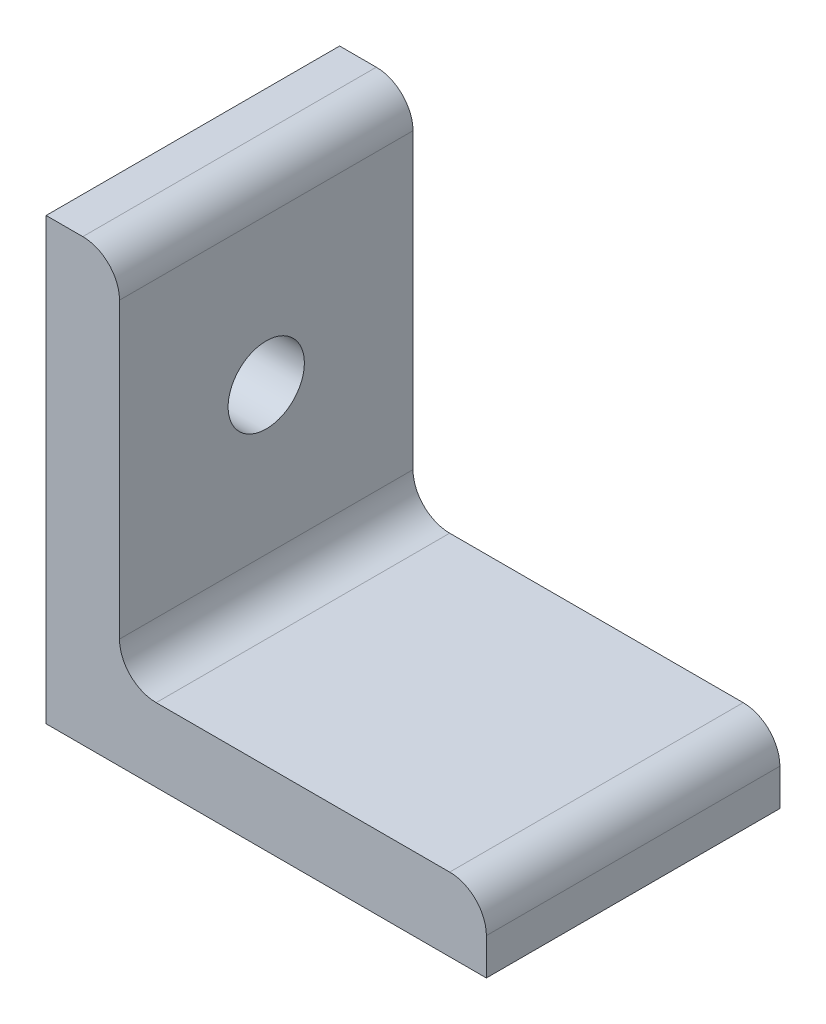
ISO-10303-21;
HEADER;
FILE_DESCRIPTION(('STEP AP214'),'2;1');
FILE_NAME('part.step','',(''),(''),'','','');
FILE_SCHEMA(('AUTOMOTIVE_DESIGN { 1 0 10303 214 1 1 1 1 }'));
ENDSEC;
DATA;
#1=APPLICATION_CONTEXT('core data for automotive mechanical design processes');
#2=APPLICATION_PROTOCOL_DEFINITION('international standard','automotive_design',2000,#1);
#3=PRODUCT_CONTEXT('',#1,'mechanical');
#4=PRODUCT('Part','Part','',(#3));
#5=PRODUCT_RELATED_PRODUCT_CATEGORY('part','',(#4));
#6=PRODUCT_DEFINITION_FORMATION('','',#4);
#7=PRODUCT_DEFINITION_CONTEXT('part definition',#1,'design');
#8=PRODUCT_DEFINITION('design','',#6,#7);
#9=PRODUCT_DEFINITION_SHAPE('','',#8);
#10=(LENGTH_UNIT() NAMED_UNIT(*) SI_UNIT(.MILLI.,.METRE.));
#11=(NAMED_UNIT(*) PLANE_ANGLE_UNIT() SI_UNIT($,.RADIAN.));
#12=(NAMED_UNIT(*) SI_UNIT($,.STERADIAN.) SOLID_ANGLE_UNIT());
#13=UNCERTAINTY_MEASURE_WITH_UNIT(LENGTH_MEASURE(1.E-05),#10,'distance_accuracy_value','');
#14=(GEOMETRIC_REPRESENTATION_CONTEXT(3) GLOBAL_UNCERTAINTY_ASSIGNED_CONTEXT((#13)) GLOBAL_UNIT_ASSIGNED_CONTEXT((#10,
#11,#12)) REPRESENTATION_CONTEXT('',''));
#15=CARTESIAN_POINT('',(0.,0.,0.));
#16=DIRECTION('',(0.,0.,1.));
#17=DIRECTION('',(1.,0.,0.));
#18=AXIS2_PLACEMENT_3D('',#15,#16,#17);
#19=CARTESIAN_POINT('',(3.175,3.175,6.35));
#20=DIRECTION('',(-1.,0.,0.));
#21=DIRECTION('',(0.,-1.,0.));
#22=AXIS2_PLACEMENT_3D('',#19,#20,#21);
#23=PLANE('',#22);
#24=CARTESIAN_POINT('',(3.175,11.1125,0.));
#25=DIRECTION('',(1.,0.,0.));
#26=DIRECTION('',(0.,0.,-1.));
#27=AXIS2_PLACEMENT_3D('',#24,#25,#26);
#28=CIRCLE('',#27,1.65);
#29=CARTESIAN_POINT('',(3.175,11.1125,-1.65));
#30=VERTEX_POINT('',#29);
#31=EDGE_CURVE('E228',#30,#30,#28,.T.);
#32=ORIENTED_EDGE('',*,*,#31,.F.);
#33=EDGE_LOOP('',(#32));
#34=FACE_BOUND('',#33,.T.);
#35=DIRECTION('',(0.,1.,0.));
#36=VECTOR('',#35,1.);
#37=CARTESIAN_POINT('',(3.175,3.175,6.35));
#38=LINE('',#37,#36);
#39=CARTESIAN_POINT('',(3.175,4.7625,6.35));
#40=VERTEX_POINT('',#39);
#41=CARTESIAN_POINT('',(3.175,17.4625,6.35));
#42=VERTEX_POINT('',#41);
#43=EDGE_CURVE('E125',#40,#42,#38,.T.);
#44=ORIENTED_EDGE('',*,*,#43,.F.);
#45=DIRECTION('',(0.,0.,-1.));
#46=VECTOR('',#45,1.);
#47=CARTESIAN_POINT('',(3.175,4.7625,-6.35));
#48=LINE('',#47,#46);
#49=CARTESIAN_POINT('',(3.175,4.7625,-6.35));
#50=VERTEX_POINT('',#49);
#51=EDGE_CURVE('E203',#40,#50,#48,.T.);
#52=ORIENTED_EDGE('',*,*,#51,.T.);
#53=DIRECTION('',(0.,1.,0.));
#54=VECTOR('',#53,1.);
#55=CARTESIAN_POINT('',(3.175,3.175,-6.35));
#56=LINE('',#55,#54);
#57=CARTESIAN_POINT('',(3.175,17.4625,-6.35));
#58=VERTEX_POINT('',#57);
#59=EDGE_CURVE('E156',#50,#58,#56,.T.);
#60=ORIENTED_EDGE('',*,*,#59,.T.);
#61=DIRECTION('',(0.,0.,-1.));
#62=VECTOR('',#61,1.);
#63=CARTESIAN_POINT('',(3.175,17.4625,6.35));
#64=LINE('',#63,#62);
#65=EDGE_CURVE('E68',#58,#42,#64,.F.);
#66=ORIENTED_EDGE('',*,*,#65,.T.);
#67=EDGE_LOOP('',(#44,#52,#60,#66));
#68=FACE_BOUND('',#67,.T.);
#69=ADVANCED_FACE('F44',(#34,#68),#23,.F.);
#70=CARTESIAN_POINT('',(3.175,19.05,6.35));
#71=DIRECTION('',(0.,-1.,0.));
#72=DIRECTION('',(0.,0.,-1.));
#73=AXIS2_PLACEMENT_3D('',#70,#71,#72);
#74=PLANE('',#73);
#75=DIRECTION('',(-1.,0.,0.));
#76=VECTOR('',#75,1.);
#77=CARTESIAN_POINT('',(3.175,19.05,6.35));
#78=LINE('',#77,#76);
#79=CARTESIAN_POINT('',(1.5875,19.05,6.35));
#80=VERTEX_POINT('',#79);
#81=CARTESIAN_POINT('',(0.,19.05,6.35));
#82=VERTEX_POINT('',#81);
#83=EDGE_CURVE('E114',#80,#82,#78,.T.);
#84=ORIENTED_EDGE('',*,*,#83,.F.);
#85=DIRECTION('',(0.,0.,-1.));
#86=VECTOR('',#85,1.);
#87=CARTESIAN_POINT('',(1.5875,19.05,6.35));
#88=LINE('',#87,#86);
#89=CARTESIAN_POINT('',(1.5875,19.05,-6.35));
#90=VERTEX_POINT('',#89);
#91=EDGE_CURVE('E207',#80,#90,#88,.T.);
#92=ORIENTED_EDGE('',*,*,#91,.T.);
#93=DIRECTION('',(-1.,0.,0.));
#94=VECTOR('',#93,1.);
#95=CARTESIAN_POINT('',(3.175,19.05,-6.35));
#96=LINE('',#95,#94);
#97=CARTESIAN_POINT('',(0.,19.05,-6.35));
#98=VERTEX_POINT('',#97);
#99=EDGE_CURVE('E131',#90,#98,#96,.T.);
#100=ORIENTED_EDGE('',*,*,#99,.T.);
#101=DIRECTION('',(0.,0.,-1.));
#102=VECTOR('',#101,1.);
#103=CARTESIAN_POINT('',(0.,19.05,6.35));
#104=LINE('',#103,#102);
#105=EDGE_CURVE('E128',#82,#98,#104,.T.);
#106=ORIENTED_EDGE('',*,*,#105,.F.);
#107=EDGE_LOOP('',(#84,#92,#100,#106));
#108=FACE_BOUND('',#107,.T.);
#109=ADVANCED_FACE('F129',(#108),#74,.F.);
#110=CARTESIAN_POINT('',(0.,19.05,6.35));
#111=DIRECTION('',(1.,0.,0.));
#112=DIRECTION('',(0.,1.,0.));
#113=AXIS2_PLACEMENT_3D('',#110,#111,#112);
#114=PLANE('',#113);
#115=CARTESIAN_POINT('',(0.,11.1125,0.));
#116=DIRECTION('',(1.,0.,0.));
#117=DIRECTION('',(0.,0.,-1.));
#118=AXIS2_PLACEMENT_3D('',#115,#116,#117);
#119=CIRCLE('',#118,1.65);
#120=CARTESIAN_POINT('',(0.,11.1125,-1.65));
#121=VERTEX_POINT('',#120);
#122=EDGE_CURVE('E159',#121,#121,#119,.T.);
#123=ORIENTED_EDGE('',*,*,#122,.T.);
#124=EDGE_LOOP('',(#123));
#125=FACE_BOUND('',#124,.T.);
#126=DIRECTION('',(0.,-1.,0.));
#127=VECTOR('',#126,1.);
#128=CARTESIAN_POINT('',(0.,19.05,-6.35));
#129=LINE('',#128,#127);
#130=CARTESIAN_POINT('',(0.,0.,-6.35));
#131=VERTEX_POINT('',#130);
#132=EDGE_CURVE('E162',#98,#131,#129,.T.);
#133=ORIENTED_EDGE('',*,*,#132,.T.);
#134=DIRECTION('',(0.,0.,-1.));
#135=VECTOR('',#134,1.);
#136=CARTESIAN_POINT('',(0.,0.,6.35));
#137=LINE('',#136,#135);
#138=CARTESIAN_POINT('',(0.,0.,6.35));
#139=VERTEX_POINT('',#138);
#140=EDGE_CURVE('E136',#139,#131,#137,.T.);
#141=ORIENTED_EDGE('',*,*,#140,.F.);
#142=DIRECTION('',(0.,-1.,0.));
#143=VECTOR('',#142,1.);
#144=CARTESIAN_POINT('',(0.,19.05,6.35));
#145=LINE('',#144,#143);
#146=EDGE_CURVE('E119',#82,#139,#145,.T.);
#147=ORIENTED_EDGE('',*,*,#146,.F.);
#148=ORIENTED_EDGE('',*,*,#105,.T.);
#149=EDGE_LOOP('',(#133,#141,#147,#148));
#150=FACE_BOUND('',#149,.T.);
#151=ADVANCED_FACE('F138',(#125,#150),#114,.F.);
#152=CARTESIAN_POINT('',(0.,0.,6.35));
#153=DIRECTION('',(0.,1.,0.));
#154=DIRECTION('',(0.,0.,1.));
#155=AXIS2_PLACEMENT_3D('',#152,#153,#154);
#156=PLANE('',#155);
#157=DIRECTION('',(1.,0.,0.));
#158=VECTOR('',#157,1.);
#159=CARTESIAN_POINT('',(0.,0.,-6.35));
#160=LINE('',#159,#158);
#161=CARTESIAN_POINT('',(19.05,0.,-6.35));
#162=VERTEX_POINT('',#161);
#163=EDGE_CURVE('E165',#131,#162,#160,.T.);
#164=ORIENTED_EDGE('',*,*,#163,.T.);
#165=DIRECTION('',(0.,0.,-1.));
#166=VECTOR('',#165,1.);
#167=CARTESIAN_POINT('',(19.05,0.,6.35));
#168=LINE('',#167,#166);
#169=CARTESIAN_POINT('',(19.05,0.,6.35));
#170=VERTEX_POINT('',#169);
#171=EDGE_CURVE('E155',#170,#162,#168,.T.);
#172=ORIENTED_EDGE('',*,*,#171,.F.);
#173=DIRECTION('',(1.,0.,0.));
#174=VECTOR('',#173,1.);
#175=CARTESIAN_POINT('',(0.,0.,6.35));
#176=LINE('',#175,#174);
#177=EDGE_CURVE('E142',#139,#170,#176,.T.);
#178=ORIENTED_EDGE('',*,*,#177,.F.);
#179=ORIENTED_EDGE('',*,*,#140,.T.);
#180=EDGE_LOOP('',(#164,#172,#178,#179));
#181=FACE_BOUND('',#180,.T.);
#182=ADVANCED_FACE('F259',(#181),#156,.F.);
#183=CARTESIAN_POINT('',(19.05,0.,6.35));
#184=DIRECTION('',(-1.,0.,0.));
#185=DIRECTION('',(0.,0.,1.));
#186=AXIS2_PLACEMENT_3D('',#183,#184,#185);
#187=PLANE('',#186);
#188=DIRECTION('',(0.,1.,0.));
#189=VECTOR('',#188,1.);
#190=CARTESIAN_POINT('',(19.05,0.,-6.35));
#191=LINE('',#190,#189);
#192=CARTESIAN_POINT('',(19.05,1.5875,-6.35));
#193=VERTEX_POINT('',#192);
#194=EDGE_CURVE('E168',#162,#193,#191,.T.);
#195=ORIENTED_EDGE('',*,*,#194,.T.);
#196=DIRECTION('',(0.,0.,-1.));
#197=VECTOR('',#196,1.);
#198=CARTESIAN_POINT('',(19.05,1.5875,6.35));
#199=LINE('',#198,#197);
#200=CARTESIAN_POINT('',(19.05,1.5875,6.35));
#201=VERTEX_POINT('',#200);
#202=EDGE_CURVE('E193',#193,#201,#199,.F.);
#203=ORIENTED_EDGE('',*,*,#202,.T.);
#204=DIRECTION('',(0.,1.,0.));
#205=VECTOR('',#204,1.);
#206=CARTESIAN_POINT('',(19.05,0.,6.35));
#207=LINE('',#206,#205);
#208=EDGE_CURVE('E145',#170,#201,#207,.T.);
#209=ORIENTED_EDGE('',*,*,#208,.F.);
#210=ORIENTED_EDGE('',*,*,#171,.T.);
#211=EDGE_LOOP('',(#195,#203,#209,#210));
#212=FACE_BOUND('',#211,.T.);
#213=ADVANCED_FACE('F265',(#212),#187,.F.);
#214=CARTESIAN_POINT('',(19.05,3.175,6.35));
#215=DIRECTION('',(0.,-1.,0.));
#216=DIRECTION('',(1.,0.,0.));
#217=AXIS2_PLACEMENT_3D('',#214,#215,#216);
#218=PLANE('',#217);
#219=DIRECTION('',(-1.,0.,0.));
#220=VECTOR('',#219,1.);
#221=CARTESIAN_POINT('',(19.05,3.175,6.35));
#222=LINE('',#221,#220);
#223=CARTESIAN_POINT('',(17.4625,3.175,6.35));
#224=VERTEX_POINT('',#223);
#225=CARTESIAN_POINT('',(4.7625,3.175,6.35));
#226=VERTEX_POINT('',#225);
#227=EDGE_CURVE('E151',#224,#226,#222,.T.);
#228=ORIENTED_EDGE('',*,*,#227,.F.);
#229=DIRECTION('',(0.,0.,-1.));
#230=VECTOR('',#229,1.);
#231=CARTESIAN_POINT('',(17.4625,3.175,6.35));
#232=LINE('',#231,#230);
#233=CARTESIAN_POINT('',(17.4625,3.175,-6.35));
#234=VERTEX_POINT('',#233);
#235=EDGE_CURVE('E183',#224,#234,#232,.T.);
#236=ORIENTED_EDGE('',*,*,#235,.T.);
#237=DIRECTION('',(-1.,0.,0.));
#238=VECTOR('',#237,1.);
#239=CARTESIAN_POINT('',(19.05,3.175,-6.35));
#240=LINE('',#239,#238);
#241=CARTESIAN_POINT('',(4.7625,3.175,-6.35));
#242=VERTEX_POINT('',#241);
#243=EDGE_CURVE('E172',#234,#242,#240,.T.);
#244=ORIENTED_EDGE('',*,*,#243,.T.);
#245=DIRECTION('',(0.,0.,-1.));
#246=VECTOR('',#245,1.);
#247=CARTESIAN_POINT('',(4.7625,3.175,6.35));
#248=LINE('',#247,#246);
#249=EDGE_CURVE('E135',#242,#226,#248,.F.);
#250=ORIENTED_EDGE('',*,*,#249,.T.);
#251=EDGE_LOOP('',(#228,#236,#244,#250));
#252=FACE_BOUND('',#251,.T.);
#253=ADVANCED_FACE('F219',(#252),#218,.F.);
#254=CARTESIAN_POINT('',(0.,0.,6.35));
#255=DIRECTION('',(0.,0.,1.));
#256=DIRECTION('',(1.,0.,0.));
#257=AXIS2_PLACEMENT_3D('',#254,#255,#256);
#258=PLANE('',#257);
#259=ORIENTED_EDGE('',*,*,#208,.T.);
#260=CARTESIAN_POINT('',(17.4625,1.5875,6.35));
#261=DIRECTION('',(0.,0.,1.));
#262=DIRECTION('',(1.,0.,0.));
#263=AXIS2_PLACEMENT_3D('',#260,#261,#262);
#264=CIRCLE('',#263,1.5875);
#265=EDGE_CURVE('E198',#201,#224,#264,.T.);
#266=ORIENTED_EDGE('',*,*,#265,.T.);
#267=ORIENTED_EDGE('',*,*,#227,.T.);
#268=CARTESIAN_POINT('',(4.7625,4.7625,6.35));
#269=DIRECTION('',(0.,0.,1.));
#270=DIRECTION('',(1.,0.,0.));
#271=AXIS2_PLACEMENT_3D('',#268,#269,#270);
#272=CIRCLE('',#271,1.5875);
#273=EDGE_CURVE('E11',#226,#40,#272,.F.);
#274=ORIENTED_EDGE('',*,*,#273,.T.);
#275=ORIENTED_EDGE('',*,*,#43,.T.);
#276=CARTESIAN_POINT('',(1.5875,17.4625,6.35));
#277=DIRECTION('',(0.,0.,1.));
#278=DIRECTION('',(1.,0.,0.));
#279=AXIS2_PLACEMENT_3D('',#276,#277,#278);
#280=CIRCLE('',#279,1.5875);
#281=EDGE_CURVE('E60',#42,#80,#280,.T.);
#282=ORIENTED_EDGE('',*,*,#281,.T.);
#283=ORIENTED_EDGE('',*,*,#83,.T.);
#284=ORIENTED_EDGE('',*,*,#146,.T.);
#285=ORIENTED_EDGE('',*,*,#177,.T.);
#286=EDGE_LOOP('',(#259,#266,#267,#274,#275,#282,#283,#284,#285));
#287=FACE_BOUND('',#286,.T.);
#288=ADVANCED_FACE('F117',(#287),#258,.T.);
#289=CARTESIAN_POINT('',(0.,0.,-6.35));
#290=DIRECTION('',(0.,0.,1.));
#291=DIRECTION('',(1.,0.,0.));
#292=AXIS2_PLACEMENT_3D('',#289,#290,#291);
#293=PLANE('',#292);
#294=ORIENTED_EDGE('',*,*,#243,.F.);
#295=CARTESIAN_POINT('',(17.4625,1.5875,-6.35));
#296=DIRECTION('',(0.,0.,1.));
#297=DIRECTION('',(1.,0.,0.));
#298=AXIS2_PLACEMENT_3D('',#295,#296,#297);
#299=CIRCLE('',#298,1.5875);
#300=EDGE_CURVE('E190',#234,#193,#299,.F.);
#301=ORIENTED_EDGE('',*,*,#300,.T.);
#302=ORIENTED_EDGE('',*,*,#194,.F.);
#303=ORIENTED_EDGE('',*,*,#163,.F.);
#304=ORIENTED_EDGE('',*,*,#132,.F.);
#305=ORIENTED_EDGE('',*,*,#99,.F.);
#306=CARTESIAN_POINT('',(1.5875,17.4625,-6.35));
#307=DIRECTION('',(0.,0.,1.));
#308=DIRECTION('',(1.,0.,0.));
#309=AXIS2_PLACEMENT_3D('',#306,#307,#308);
#310=CIRCLE('',#309,1.5875);
#311=EDGE_CURVE('E187',#90,#58,#310,.F.);
#312=ORIENTED_EDGE('',*,*,#311,.T.);
#313=ORIENTED_EDGE('',*,*,#59,.F.);
#314=CARTESIAN_POINT('',(4.7625,4.7625,-6.35));
#315=DIRECTION('',(0.,0.,1.));
#316=DIRECTION('',(1.,0.,0.));
#317=AXIS2_PLACEMENT_3D('',#314,#315,#316);
#318=CIRCLE('',#317,1.5875);
#319=EDGE_CURVE('E53',#50,#242,#318,.T.);
#320=ORIENTED_EDGE('',*,*,#319,.T.);
#321=EDGE_LOOP('',(#294,#301,#302,#303,#304,#305,#312,#313,#320));
#322=FACE_BOUND('',#321,.T.);
#323=ADVANCED_FACE('F213',(#322),#293,.F.);
#324=CARTESIAN_POINT('',(17.4625,1.5875,6.35));
#325=DIRECTION('',(0.,0.,-1.));
#326=DIRECTION('',(-1.,0.,0.));
#327=AXIS2_PLACEMENT_3D('',#324,#325,#326);
#328=CYLINDRICAL_SURFACE('',#327,1.5875);
#329=ORIENTED_EDGE('',*,*,#265,.F.);
#330=ORIENTED_EDGE('',*,*,#202,.F.);
#331=ORIENTED_EDGE('',*,*,#300,.F.);
#332=ORIENTED_EDGE('',*,*,#235,.F.);
#333=EDGE_LOOP('',(#329,#330,#331,#332));
#334=FACE_BOUND('',#333,.T.);
#335=ADVANCED_FACE('F243',(#334),#328,.T.);
#336=CARTESIAN_POINT('',(4.7625,4.7625,6.35));
#337=DIRECTION('',(0.,0.,1.));
#338=DIRECTION('',(1.,0.,0.));
#339=AXIS2_PLACEMENT_3D('',#336,#337,#338);
#340=CYLINDRICAL_SURFACE('',#339,1.5875);
#341=ORIENTED_EDGE('',*,*,#273,.F.);
#342=ORIENTED_EDGE('',*,*,#249,.F.);
#343=ORIENTED_EDGE('',*,*,#319,.F.);
#344=ORIENTED_EDGE('',*,*,#51,.F.);
#345=EDGE_LOOP('',(#341,#342,#343,#344));
#346=FACE_BOUND('',#345,.T.);
#347=ADVANCED_FACE('F222',(#346),#340,.F.);
#348=CARTESIAN_POINT('',(1.5875,17.4625,6.35));
#349=DIRECTION('',(0.,0.,-1.));
#350=DIRECTION('',(-1.,0.,0.));
#351=AXIS2_PLACEMENT_3D('',#348,#349,#350);
#352=CYLINDRICAL_SURFACE('',#351,1.5875);
#353=ORIENTED_EDGE('',*,*,#281,.F.);
#354=ORIENTED_EDGE('',*,*,#65,.F.);
#355=ORIENTED_EDGE('',*,*,#311,.F.);
#356=ORIENTED_EDGE('',*,*,#91,.F.);
#357=EDGE_LOOP('',(#353,#354,#355,#356));
#358=FACE_BOUND('',#357,.T.);
#359=ADVANCED_FACE('F46',(#358),#352,.T.);
#360=CARTESIAN_POINT('',(3.175,11.1125,0.));
#361=DIRECTION('',(1.,0.,0.));
#362=DIRECTION('',(0.,0.,-1.));
#363=AXIS2_PLACEMENT_3D('',#360,#361,#362);
#364=CYLINDRICAL_SURFACE('',#363,1.65);
#365=ORIENTED_EDGE('',*,*,#122,.F.);
#366=EDGE_LOOP('',(#365));
#367=FACE_BOUND('',#366,.T.);
#368=ORIENTED_EDGE('',*,*,#31,.T.);
#369=EDGE_LOOP('',(#368));
#370=FACE_BOUND('',#369,.T.);
#371=ADVANCED_FACE('F233',(#367,#370),#364,.F.);
#372=CLOSED_SHELL('',(#69,#109,#151,#182,#213,#253,#288,#323,#335,#347,#359,#371));
#373=MANIFOLD_SOLID_BREP('B2',#372);
#374=ADVANCED_BREP_SHAPE_REPRESENTATION('',(#18,#373),#14);
#375=SHAPE_DEFINITION_REPRESENTATION(#9,#374);
ENDSEC;
END-ISO-10303-21;
